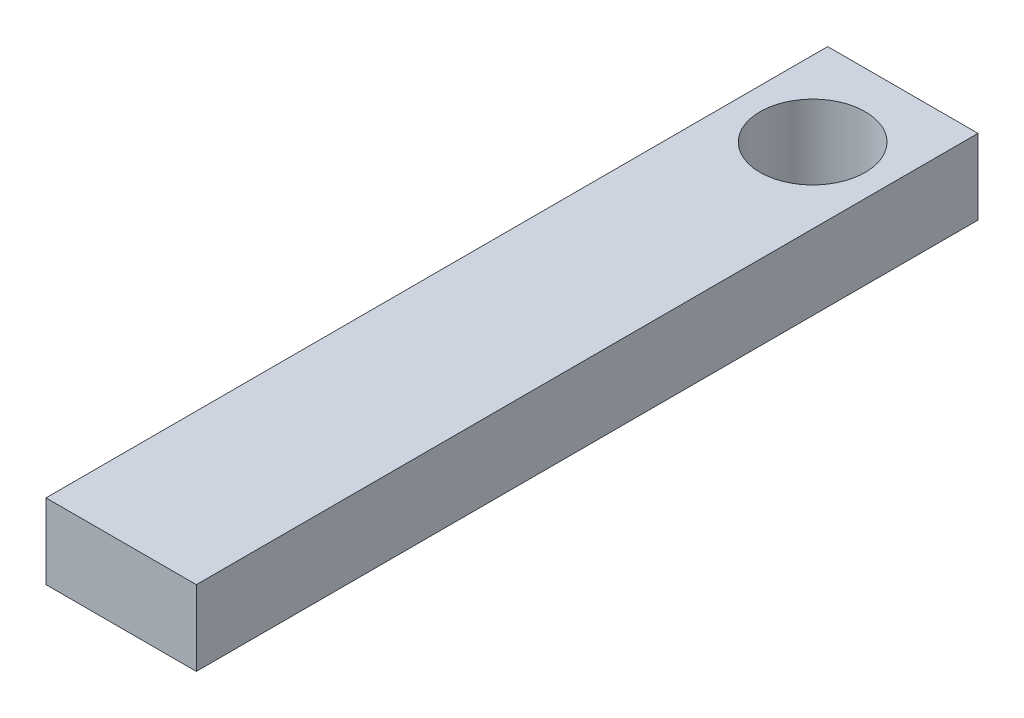
ISO-10303-21;
HEADER;
FILE_DESCRIPTION(('STEP AP214'),'2;1');
FILE_NAME('part.step','',(''),(''),'','','');
FILE_SCHEMA(('AUTOMOTIVE_DESIGN { 1 0 10303 214 1 1 1 1 }'));
ENDSEC;
DATA;
#1=APPLICATION_CONTEXT('core data for automotive mechanical design processes');
#2=APPLICATION_PROTOCOL_DEFINITION('international standard','automotive_design',2000,#1);
#3=PRODUCT_CONTEXT('',#1,'mechanical');
#4=PRODUCT('Part','Part','',(#3));
#5=PRODUCT_RELATED_PRODUCT_CATEGORY('part','',(#4));
#6=PRODUCT_DEFINITION_FORMATION('','',#4);
#7=PRODUCT_DEFINITION_CONTEXT('part definition',#1,'design');
#8=PRODUCT_DEFINITION('design','',#6,#7);
#9=PRODUCT_DEFINITION_SHAPE('','',#8);
#10=(LENGTH_UNIT() NAMED_UNIT(*) SI_UNIT(.MILLI.,.METRE.));
#11=(NAMED_UNIT(*) PLANE_ANGLE_UNIT() SI_UNIT($,.RADIAN.));
#12=(NAMED_UNIT(*) SI_UNIT($,.STERADIAN.) SOLID_ANGLE_UNIT());
#13=UNCERTAINTY_MEASURE_WITH_UNIT(LENGTH_MEASURE(1.E-05),#10,'distance_accuracy_value','');
#14=(GEOMETRIC_REPRESENTATION_CONTEXT(3) GLOBAL_UNCERTAINTY_ASSIGNED_CONTEXT((#13)) GLOBAL_UNIT_ASSIGNED_CONTEXT((#10,
#11,#12)) REPRESENTATION_CONTEXT('',''));
#15=CARTESIAN_POINT('',(0.,0.,0.));
#16=DIRECTION('',(0.,0.,1.));
#17=DIRECTION('',(1.,0.,0.));
#18=AXIS2_PLACEMENT_3D('',#15,#16,#17);
#19=CARTESIAN_POINT('',(0.,5.,0.));
#20=DIRECTION('',(0.,-1.,0.));
#21=DIRECTION('',(0.,0.,-1.));
#22=AXIS2_PLACEMENT_3D('',#19,#20,#21);
#23=PLANE('',#22);
#24=DIRECTION('',(0.,0.,1.));
#25=VECTOR('',#24,1.);
#26=CARTESIAN_POINT('',(0.,5.,0.));
#27=LINE('',#26,#25);
#28=CARTESIAN_POINT('',(0.,5.,-52.));
#29=VERTEX_POINT('',#28);
#30=CARTESIAN_POINT('',(0.,5.,0.));
#31=VERTEX_POINT('',#30);
#32=EDGE_CURVE('E92',#29,#31,#27,.T.);
#33=ORIENTED_EDGE('',*,*,#32,.T.);
#34=DIRECTION('',(1.,0.,0.));
#35=VECTOR('',#34,1.);
#36=CARTESIAN_POINT('',(0.,5.,0.));
#37=LINE('',#36,#35);
#38=CARTESIAN_POINT('',(10.,5.,0.));
#39=VERTEX_POINT('',#38);
#40=EDGE_CURVE('E87',#31,#39,#37,.T.);
#41=ORIENTED_EDGE('',*,*,#40,.T.);
#42=DIRECTION('',(0.,0.,-1.));
#43=VECTOR('',#42,1.);
#44=CARTESIAN_POINT('',(10.,5.,0.));
#45=LINE('',#44,#43);
#46=CARTESIAN_POINT('',(10.,5.,-52.));
#47=VERTEX_POINT('',#46);
#48=EDGE_CURVE('E90',#39,#47,#45,.T.);
#49=ORIENTED_EDGE('',*,*,#48,.T.);
#50=DIRECTION('',(-1.,0.,0.));
#51=VECTOR('',#50,1.);
#52=CARTESIAN_POINT('',(0.,5.,-52.));
#53=LINE('',#52,#51);
#54=EDGE_CURVE('E57',#47,#29,#53,.T.);
#55=ORIENTED_EDGE('',*,*,#54,.T.);
#56=EDGE_LOOP('',(#33,#41,#49,#55));
#57=FACE_BOUND('',#56,.T.);
#58=CARTESIAN_POINT('',(5.,5.,-46.));
#59=DIRECTION('',(0.,1.,0.));
#60=DIRECTION('',(0.,0.,1.));
#61=AXIS2_PLACEMENT_3D('',#58,#59,#60);
#62=CIRCLE('',#61,3.5);
#63=CARTESIAN_POINT('',(5.,5.,-42.5));
#64=VERTEX_POINT('',#63);
#65=EDGE_CURVE('E112',#64,#64,#62,.T.);
#66=ORIENTED_EDGE('',*,*,#65,.F.);
#67=EDGE_LOOP('',(#66));
#68=FACE_BOUND('',#67,.T.);
#69=ADVANCED_FACE('F39',(#57,#68),#23,.F.);
#70=CARTESIAN_POINT('',(0.,0.,0.));
#71=DIRECTION('',(0.,-1.,0.));
#72=DIRECTION('',(0.,0.,-1.));
#73=AXIS2_PLACEMENT_3D('',#70,#71,#72);
#74=PLANE('',#73);
#75=DIRECTION('',(0.,0.,1.));
#76=VECTOR('',#75,1.);
#77=CARTESIAN_POINT('',(0.,0.,0.));
#78=LINE('',#77,#76);
#79=CARTESIAN_POINT('',(0.,0.,-52.));
#80=VERTEX_POINT('',#79);
#81=CARTESIAN_POINT('',(0.,0.,0.));
#82=VERTEX_POINT('',#81);
#83=EDGE_CURVE('E108',#80,#82,#78,.T.);
#84=ORIENTED_EDGE('',*,*,#83,.F.);
#85=DIRECTION('',(-1.,0.,0.));
#86=VECTOR('',#85,1.);
#87=CARTESIAN_POINT('',(0.,0.,-52.));
#88=LINE('',#87,#86);
#89=CARTESIAN_POINT('',(10.,0.,-52.));
#90=VERTEX_POINT('',#89);
#91=EDGE_CURVE('E80',#90,#80,#88,.T.);
#92=ORIENTED_EDGE('',*,*,#91,.F.);
#93=DIRECTION('',(0.,0.,-1.));
#94=VECTOR('',#93,1.);
#95=CARTESIAN_POINT('',(10.,0.,0.));
#96=LINE('',#95,#94);
#97=CARTESIAN_POINT('',(10.,0.,0.));
#98=VERTEX_POINT('',#97);
#99=EDGE_CURVE('E74',#98,#90,#96,.T.);
#100=ORIENTED_EDGE('',*,*,#99,.F.);
#101=DIRECTION('',(1.,0.,0.));
#102=VECTOR('',#101,1.);
#103=CARTESIAN_POINT('',(0.,0.,0.));
#104=LINE('',#103,#102);
#105=EDGE_CURVE('E97',#82,#98,#104,.T.);
#106=ORIENTED_EDGE('',*,*,#105,.F.);
#107=EDGE_LOOP('',(#84,#92,#100,#106));
#108=FACE_BOUND('',#107,.T.);
#109=CARTESIAN_POINT('',(5.,0.,-46.));
#110=DIRECTION('',(0.,1.,0.));
#111=DIRECTION('',(0.,0.,1.));
#112=AXIS2_PLACEMENT_3D('',#109,#110,#111);
#113=CIRCLE('',#112,3.5);
#114=CARTESIAN_POINT('',(5.,0.,-42.5));
#115=VERTEX_POINT('',#114);
#116=EDGE_CURVE('E130',#115,#115,#113,.T.);
#117=ORIENTED_EDGE('',*,*,#116,.T.);
#118=EDGE_LOOP('',(#117));
#119=FACE_BOUND('',#118,.T.);
#120=ADVANCED_FACE('F125',(#108,#119),#74,.T.);
#121=CARTESIAN_POINT('',(0.,5.,0.));
#122=DIRECTION('',(1.,0.,0.));
#123=DIRECTION('',(0.,0.,-1.));
#124=AXIS2_PLACEMENT_3D('',#121,#122,#123);
#125=PLANE('',#124);
#126=ORIENTED_EDGE('',*,*,#83,.T.);
#127=DIRECTION('',(0.,-1.,0.));
#128=VECTOR('',#127,1.);
#129=CARTESIAN_POINT('',(0.,5.,0.));
#130=LINE('',#129,#128);
#131=EDGE_CURVE('E11',#31,#82,#130,.T.);
#132=ORIENTED_EDGE('',*,*,#131,.F.);
#133=ORIENTED_EDGE('',*,*,#32,.F.);
#134=DIRECTION('',(0.,-1.,0.));
#135=VECTOR('',#134,1.);
#136=CARTESIAN_POINT('',(0.,5.,-52.));
#137=LINE('',#136,#135);
#138=EDGE_CURVE('E104',#29,#80,#137,.T.);
#139=ORIENTED_EDGE('',*,*,#138,.T.);
#140=EDGE_LOOP('',(#126,#132,#133,#139));
#141=FACE_BOUND('',#140,.T.);
#142=ADVANCED_FACE('F41',(#141),#125,.F.);
#143=CARTESIAN_POINT('',(0.,5.,0.));
#144=DIRECTION('',(0.,0.,-1.));
#145=DIRECTION('',(-1.,0.,0.));
#146=AXIS2_PLACEMENT_3D('',#143,#144,#145);
#147=PLANE('',#146);
#148=ORIENTED_EDGE('',*,*,#105,.T.);
#149=DIRECTION('',(0.,-1.,0.));
#150=VECTOR('',#149,1.);
#151=CARTESIAN_POINT('',(10.,5.,0.));
#152=LINE('',#151,#150);
#153=EDGE_CURVE('E49',#39,#98,#152,.T.);
#154=ORIENTED_EDGE('',*,*,#153,.F.);
#155=ORIENTED_EDGE('',*,*,#40,.F.);
#156=ORIENTED_EDGE('',*,*,#131,.T.);
#157=EDGE_LOOP('',(#148,#154,#155,#156));
#158=FACE_BOUND('',#157,.T.);
#159=ADVANCED_FACE('F96',(#158),#147,.F.);
#160=CARTESIAN_POINT('',(10.,5.,0.));
#161=DIRECTION('',(-1.,0.,0.));
#162=DIRECTION('',(0.,0.,1.));
#163=AXIS2_PLACEMENT_3D('',#160,#161,#162);
#164=PLANE('',#163);
#165=ORIENTED_EDGE('',*,*,#99,.T.);
#166=DIRECTION('',(0.,-1.,0.));
#167=VECTOR('',#166,1.);
#168=CARTESIAN_POINT('',(10.,5.,-52.));
#169=LINE('',#168,#167);
#170=EDGE_CURVE('E99',#47,#90,#169,.T.);
#171=ORIENTED_EDGE('',*,*,#170,.F.);
#172=ORIENTED_EDGE('',*,*,#48,.F.);
#173=ORIENTED_EDGE('',*,*,#153,.T.);
#174=EDGE_LOOP('',(#165,#171,#172,#173));
#175=FACE_BOUND('',#174,.T.);
#176=ADVANCED_FACE('F100',(#175),#164,.F.);
#177=CARTESIAN_POINT('',(0.,5.,-52.));
#178=DIRECTION('',(0.,0.,1.));
#179=DIRECTION('',(1.,0.,0.));
#180=AXIS2_PLACEMENT_3D('',#177,#178,#179);
#181=PLANE('',#180);
#182=ORIENTED_EDGE('',*,*,#91,.T.);
#183=ORIENTED_EDGE('',*,*,#138,.F.);
#184=ORIENTED_EDGE('',*,*,#54,.F.);
#185=ORIENTED_EDGE('',*,*,#170,.T.);
#186=EDGE_LOOP('',(#182,#183,#184,#185));
#187=FACE_BOUND('',#186,.T.);
#188=ADVANCED_FACE('F122',(#187),#181,.F.);
#189=CARTESIAN_POINT('',(5.,5.,-46.));
#190=DIRECTION('',(0.,-1.,0.));
#191=DIRECTION('',(0.,0.,-1.));
#192=AXIS2_PLACEMENT_3D('',#189,#190,#191);
#193=CYLINDRICAL_SURFACE('',#192,3.5);
#194=ORIENTED_EDGE('',*,*,#65,.T.);
#195=EDGE_LOOP('',(#194));
#196=FACE_BOUND('',#195,.T.);
#197=ORIENTED_EDGE('',*,*,#116,.F.);
#198=EDGE_LOOP('',(#197));
#199=FACE_BOUND('',#198,.T.);
#200=ADVANCED_FACE('F138',(#196,#199),#193,.F.);
#201=CLOSED_SHELL('',(#69,#120,#142,#159,#176,#188,#200));
#202=MANIFOLD_SOLID_BREP('B2',#201);
#203=ADVANCED_BREP_SHAPE_REPRESENTATION('',(#18,#202),#14);
#204=SHAPE_DEFINITION_REPRESENTATION(#9,#203);
ENDSEC;
END-ISO-10303-21;
